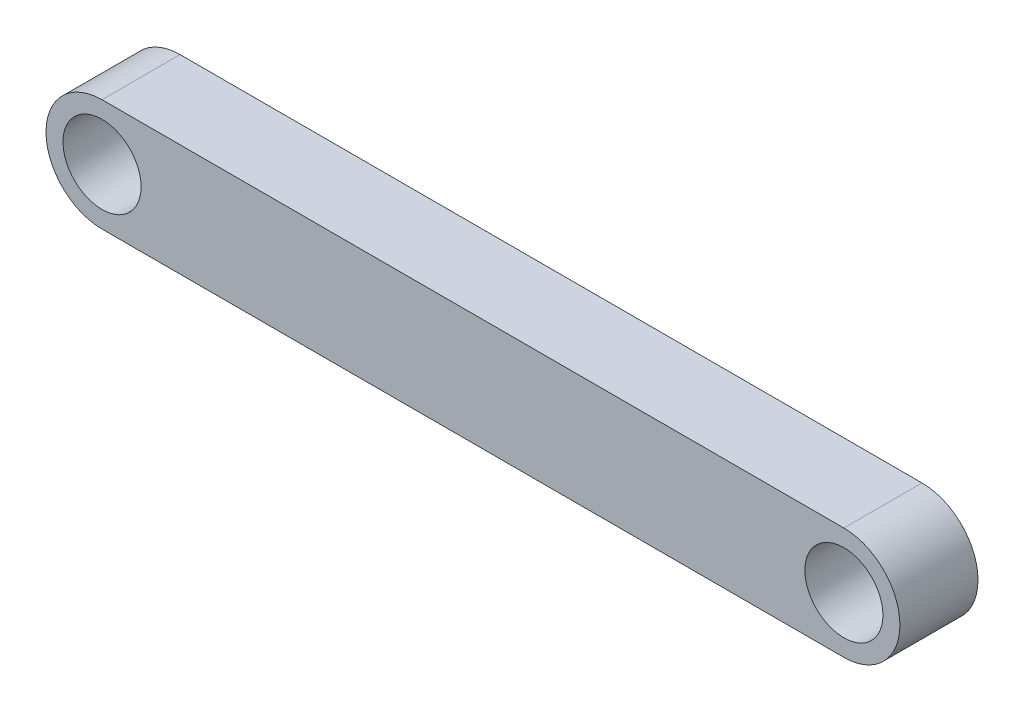
ISO-10303-21;
HEADER;
FILE_DESCRIPTION(('STEP AP214'),'2;1');
FILE_NAME('part.step','',(''),(''),'','','');
FILE_SCHEMA(('AUTOMOTIVE_DESIGN { 1 0 10303 214 1 1 1 1 }'));
ENDSEC;
DATA;
#1=APPLICATION_CONTEXT('core data for automotive mechanical design processes');
#2=APPLICATION_PROTOCOL_DEFINITION('international standard','automotive_design',2000,#1);
#3=PRODUCT_CONTEXT('',#1,'mechanical');
#4=PRODUCT('Part','Part','',(#3));
#5=PRODUCT_RELATED_PRODUCT_CATEGORY('part','',(#4));
#6=PRODUCT_DEFINITION_FORMATION('','',#4);
#7=PRODUCT_DEFINITION_CONTEXT('part definition',#1,'design');
#8=PRODUCT_DEFINITION('design','',#6,#7);
#9=PRODUCT_DEFINITION_SHAPE('','',#8);
#10=(LENGTH_UNIT() NAMED_UNIT(*) SI_UNIT(.MILLI.,.METRE.));
#11=(NAMED_UNIT(*) PLANE_ANGLE_UNIT() SI_UNIT($,.RADIAN.));
#12=(NAMED_UNIT(*) SI_UNIT($,.STERADIAN.) SOLID_ANGLE_UNIT());
#13=UNCERTAINTY_MEASURE_WITH_UNIT(LENGTH_MEASURE(1.E-05),#10,'distance_accuracy_value','');
#14=(GEOMETRIC_REPRESENTATION_CONTEXT(3) GLOBAL_UNCERTAINTY_ASSIGNED_CONTEXT((#13)) GLOBAL_UNIT_ASSIGNED_CONTEXT((#10,
#11,#12)) REPRESENTATION_CONTEXT('',''));
#15=CARTESIAN_POINT('',(0.,0.,0.));
#16=DIRECTION('',(0.,0.,1.));
#17=DIRECTION('',(1.,0.,0.));
#18=AXIS2_PLACEMENT_3D('',#15,#16,#17);
#19=CARTESIAN_POINT('',(-9.07346938775511,0.,2.));
#20=DIRECTION('',(0.,0.,1.));
#21=DIRECTION('',(1.,0.,0.));
#22=AXIS2_PLACEMENT_3D('',#19,#20,#21);
#23=PLANE('',#22);
#24=CARTESIAN_POINT('',(9.92653061224489,0.,2.));
#25=DIRECTION('',(0.,0.,1.));
#26=DIRECTION('',(1.,0.,0.));
#27=AXIS2_PLACEMENT_3D('',#24,#25,#26);
#28=CIRCLE('',#27,1.);
#29=CARTESIAN_POINT('',(10.9265306122449,0.,2.));
#30=VERTEX_POINT('',#29);
#31=EDGE_CURVE('E100',#30,#30,#28,.T.);
#32=ORIENTED_EDGE('',*,*,#31,.F.);
#33=EDGE_LOOP('',(#32));
#34=FACE_BOUND('',#33,.T.);
#35=CARTESIAN_POINT('',(-9.07346938775511,0.,2.));
#36=DIRECTION('',(0.,0.,1.));
#37=DIRECTION('',(1.,0.,0.));
#38=AXIS2_PLACEMENT_3D('',#35,#36,#37);
#39=CIRCLE('',#38,1.43469387755102);
#40=CARTESIAN_POINT('',(-9.07346938775511,1.43469387755102,2.));
#41=VERTEX_POINT('',#40);
#42=CARTESIAN_POINT('',(-9.07346938775511,-1.43469387755102,2.));
#43=VERTEX_POINT('',#42);
#44=EDGE_CURVE('E85',#41,#43,#39,.T.);
#45=ORIENTED_EDGE('',*,*,#44,.T.);
#46=DIRECTION('',(1.,0.,0.));
#47=VECTOR('',#46,1.);
#48=CARTESIAN_POINT('',(-9.07346938775511,-1.43469387755102,2.));
#49=LINE('',#48,#47);
#50=CARTESIAN_POINT('',(9.92653061224489,-1.43469387755102,2.));
#51=VERTEX_POINT('',#50);
#52=EDGE_CURVE('E80',#43,#51,#49,.T.);
#53=ORIENTED_EDGE('',*,*,#52,.T.);
#54=CARTESIAN_POINT('',(9.92653061224489,0.,2.));
#55=DIRECTION('',(0.,0.,1.));
#56=DIRECTION('',(1.,0.,0.));
#57=AXIS2_PLACEMENT_3D('',#54,#55,#56);
#58=CIRCLE('',#57,1.43469387755102);
#59=CARTESIAN_POINT('',(9.92653061224489,1.43469387755102,2.));
#60=VERTEX_POINT('',#59);
#61=EDGE_CURVE('E83',#51,#60,#58,.T.);
#62=ORIENTED_EDGE('',*,*,#61,.T.);
#63=DIRECTION('',(-1.,0.,0.));
#64=VECTOR('',#63,1.);
#65=CARTESIAN_POINT('',(-9.07346938775511,1.43469387755102,2.));
#66=LINE('',#65,#64);
#67=EDGE_CURVE('E50',#60,#41,#66,.T.);
#68=ORIENTED_EDGE('',*,*,#67,.T.);
#69=EDGE_LOOP('',(#45,#53,#62,#68));
#70=FACE_BOUND('',#69,.T.);
#71=CARTESIAN_POINT('',(-9.07346938775511,0.,2.));
#72=DIRECTION('',(0.,0.,1.));
#73=DIRECTION('',(1.,0.,0.));
#74=AXIS2_PLACEMENT_3D('',#71,#72,#73);
#75=CIRCLE('',#74,1.);
#76=CARTESIAN_POINT('',(-8.07346938775511,0.,2.));
#77=VERTEX_POINT('',#76);
#78=EDGE_CURVE('E115',#77,#77,#75,.T.);
#79=ORIENTED_EDGE('',*,*,#78,.F.);
#80=EDGE_LOOP('',(#79));
#81=FACE_BOUND('',#80,.T.);
#82=ADVANCED_FACE('F33',(#34,#70,#81),#23,.T.);
#83=CARTESIAN_POINT('',(-9.07346938775511,0.,0.));
#84=DIRECTION('',(0.,0.,1.));
#85=DIRECTION('',(1.,0.,0.));
#86=AXIS2_PLACEMENT_3D('',#83,#84,#85);
#87=PLANE('',#86);
#88=CARTESIAN_POINT('',(-9.07346938775511,0.,0.));
#89=DIRECTION('',(0.,0.,1.));
#90=DIRECTION('',(1.,0.,0.));
#91=AXIS2_PLACEMENT_3D('',#88,#89,#90);
#92=CIRCLE('',#91,1.43469387755102);
#93=CARTESIAN_POINT('',(-9.07346938775511,1.43469387755102,0.));
#94=VERTEX_POINT('',#93);
#95=CARTESIAN_POINT('',(-9.07346938775511,-1.43469387755102,0.));
#96=VERTEX_POINT('',#95);
#97=EDGE_CURVE('E97',#94,#96,#92,.T.);
#98=ORIENTED_EDGE('',*,*,#97,.F.);
#99=DIRECTION('',(-1.,0.,0.));
#100=VECTOR('',#99,1.);
#101=CARTESIAN_POINT('',(-9.07346938775511,1.43469387755102,0.));
#102=LINE('',#101,#100);
#103=CARTESIAN_POINT('',(9.92653061224489,1.43469387755102,0.));
#104=VERTEX_POINT('',#103);
#105=EDGE_CURVE('E73',#104,#94,#102,.T.);
#106=ORIENTED_EDGE('',*,*,#105,.F.);
#107=CARTESIAN_POINT('',(9.92653061224489,0.,0.));
#108=DIRECTION('',(0.,0.,1.));
#109=DIRECTION('',(1.,0.,0.));
#110=AXIS2_PLACEMENT_3D('',#107,#108,#109);
#111=CIRCLE('',#110,1.43469387755102);
#112=CARTESIAN_POINT('',(9.92653061224489,-1.43469387755102,0.));
#113=VERTEX_POINT('',#112);
#114=EDGE_CURVE('E67',#113,#104,#111,.T.);
#115=ORIENTED_EDGE('',*,*,#114,.F.);
#116=DIRECTION('',(1.,0.,0.));
#117=VECTOR('',#116,1.);
#118=CARTESIAN_POINT('',(-9.07346938775511,-1.43469387755102,0.));
#119=LINE('',#118,#117);
#120=EDGE_CURVE('E89',#96,#113,#119,.T.);
#121=ORIENTED_EDGE('',*,*,#120,.F.);
#122=EDGE_LOOP('',(#98,#106,#115,#121));
#123=FACE_BOUND('',#122,.T.);
#124=CARTESIAN_POINT('',(9.92653061224489,0.,0.));
#125=DIRECTION('',(0.,0.,1.));
#126=DIRECTION('',(1.,0.,0.));
#127=AXIS2_PLACEMENT_3D('',#124,#125,#126);
#128=CIRCLE('',#127,1.);
#129=CARTESIAN_POINT('',(10.9265306122449,0.,0.));
#130=VERTEX_POINT('',#129);
#131=EDGE_CURVE('E112',#130,#130,#128,.T.);
#132=ORIENTED_EDGE('',*,*,#131,.T.);
#133=EDGE_LOOP('',(#132));
#134=FACE_BOUND('',#133,.T.);
#135=CARTESIAN_POINT('',(-9.07346938775511,0.,0.));
#136=DIRECTION('',(0.,0.,1.));
#137=DIRECTION('',(1.,0.,0.));
#138=AXIS2_PLACEMENT_3D('',#135,#136,#137);
#139=CIRCLE('',#138,1.);
#140=CARTESIAN_POINT('',(-8.07346938775511,0.,0.));
#141=VERTEX_POINT('',#140);
#142=EDGE_CURVE('E118',#141,#141,#139,.T.);
#143=ORIENTED_EDGE('',*,*,#142,.T.);
#144=EDGE_LOOP('',(#143));
#145=FACE_BOUND('',#144,.T.);
#146=ADVANCED_FACE('F108',(#123,#134,#145),#87,.F.);
#147=CARTESIAN_POINT('',(-9.07346938775511,0.,2.));
#148=DIRECTION('',(0.,0.,-1.));
#149=DIRECTION('',(-1.,0.,0.));
#150=AXIS2_PLACEMENT_3D('',#147,#148,#149);
#151=CYLINDRICAL_SURFACE('',#150,1.43469387755102);
#152=ORIENTED_EDGE('',*,*,#97,.T.);
#153=DIRECTION('',(0.,0.,-1.));
#154=VECTOR('',#153,1.);
#155=CARTESIAN_POINT('',(-9.07346938775511,-1.43469387755102,2.));
#156=LINE('',#155,#154);
#157=EDGE_CURVE('E11',#43,#96,#156,.T.);
#158=ORIENTED_EDGE('',*,*,#157,.F.);
#159=ORIENTED_EDGE('',*,*,#44,.F.);
#160=DIRECTION('',(0.,0.,-1.));
#161=VECTOR('',#160,1.);
#162=CARTESIAN_POINT('',(-9.07346938775511,1.43469387755102,2.));
#163=LINE('',#162,#161);
#164=EDGE_CURVE('E93',#41,#94,#163,.T.);
#165=ORIENTED_EDGE('',*,*,#164,.T.);
#166=EDGE_LOOP('',(#152,#158,#159,#165));
#167=FACE_BOUND('',#166,.T.);
#168=ADVANCED_FACE('F35',(#167),#151,.T.);
#169=CARTESIAN_POINT('',(-9.07346938775511,-1.43469387755102,2.));
#170=DIRECTION('',(0.,1.,0.));
#171=DIRECTION('',(0.,0.,1.));
#172=AXIS2_PLACEMENT_3D('',#169,#170,#171);
#173=PLANE('',#172);
#174=ORIENTED_EDGE('',*,*,#120,.T.);
#175=DIRECTION('',(0.,0.,-1.));
#176=VECTOR('',#175,1.);
#177=CARTESIAN_POINT('',(9.92653061224489,-1.43469387755102,2.));
#178=LINE('',#177,#176);
#179=EDGE_CURVE('E42',#51,#113,#178,.T.);
#180=ORIENTED_EDGE('',*,*,#179,.F.);
#181=ORIENTED_EDGE('',*,*,#52,.F.);
#182=ORIENTED_EDGE('',*,*,#157,.T.);
#183=EDGE_LOOP('',(#174,#180,#181,#182));
#184=FACE_BOUND('',#183,.T.);
#185=ADVANCED_FACE('F88',(#184),#173,.F.);
#186=CARTESIAN_POINT('',(9.92653061224489,0.,2.));
#187=DIRECTION('',(0.,0.,-1.));
#188=DIRECTION('',(-1.,0.,0.));
#189=AXIS2_PLACEMENT_3D('',#186,#187,#188);
#190=CYLINDRICAL_SURFACE('',#189,1.43469387755102);
#191=ORIENTED_EDGE('',*,*,#114,.T.);
#192=DIRECTION('',(0.,0.,-1.));
#193=VECTOR('',#192,1.);
#194=CARTESIAN_POINT('',(9.92653061224489,1.43469387755102,2.));
#195=LINE('',#194,#193);
#196=EDGE_CURVE('E90',#60,#104,#195,.T.);
#197=ORIENTED_EDGE('',*,*,#196,.F.);
#198=ORIENTED_EDGE('',*,*,#61,.F.);
#199=ORIENTED_EDGE('',*,*,#179,.T.);
#200=EDGE_LOOP('',(#191,#197,#198,#199));
#201=FACE_BOUND('',#200,.T.);
#202=ADVANCED_FACE('F91',(#201),#190,.T.);
#203=CARTESIAN_POINT('',(-9.07346938775511,1.43469387755102,2.));
#204=DIRECTION('',(0.,-1.,0.));
#205=DIRECTION('',(0.,0.,-1.));
#206=AXIS2_PLACEMENT_3D('',#203,#204,#205);
#207=PLANE('',#206);
#208=ORIENTED_EDGE('',*,*,#105,.T.);
#209=ORIENTED_EDGE('',*,*,#164,.F.);
#210=ORIENTED_EDGE('',*,*,#67,.F.);
#211=ORIENTED_EDGE('',*,*,#196,.T.);
#212=EDGE_LOOP('',(#208,#209,#210,#211));
#213=FACE_BOUND('',#212,.T.);
#214=ADVANCED_FACE('F105',(#213),#207,.F.);
#215=CARTESIAN_POINT('',(9.92653061224489,0.,2.));
#216=DIRECTION('',(0.,0.,-1.));
#217=DIRECTION('',(-1.,0.,0.));
#218=AXIS2_PLACEMENT_3D('',#215,#216,#217);
#219=CYLINDRICAL_SURFACE('',#218,1.);
#220=ORIENTED_EDGE('',*,*,#31,.T.);
#221=EDGE_LOOP('',(#220));
#222=FACE_BOUND('',#221,.T.);
#223=ORIENTED_EDGE('',*,*,#131,.F.);
#224=EDGE_LOOP('',(#223));
#225=FACE_BOUND('',#224,.T.);
#226=ADVANCED_FACE('F135',(#222,#225),#219,.F.);
#227=CARTESIAN_POINT('',(-9.07346938775511,0.,2.));
#228=DIRECTION('',(0.,0.,-1.));
#229=DIRECTION('',(-1.,0.,0.));
#230=AXIS2_PLACEMENT_3D('',#227,#228,#229);
#231=CYLINDRICAL_SURFACE('',#230,1.);
#232=ORIENTED_EDGE('',*,*,#78,.T.);
#233=EDGE_LOOP('',(#232));
#234=FACE_BOUND('',#233,.T.);
#235=ORIENTED_EDGE('',*,*,#142,.F.);
#236=EDGE_LOOP('',(#235));
#237=FACE_BOUND('',#236,.T.);
#238=ADVANCED_FACE('F124',(#234,#237),#231,.F.);
#239=CLOSED_SHELL('',(#82,#146,#168,#185,#202,#214,#226,#238));
#240=MANIFOLD_SOLID_BREP('B2',#239);
#241=ADVANCED_BREP_SHAPE_REPRESENTATION('',(#18,#240),#14);
#242=SHAPE_DEFINITION_REPRESENTATION(#9,#241);
ENDSEC;
END-ISO-10303-21;
